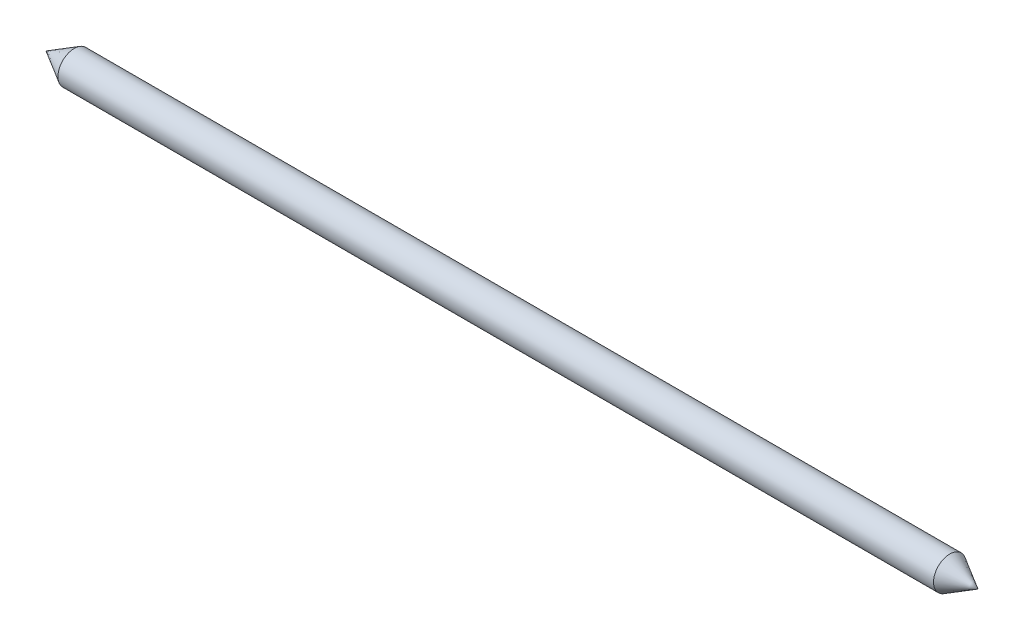
ISO-10303-21;
HEADER;
FILE_DESCRIPTION(('STEP AP214'),'2;1');
FILE_NAME('part.step','',(''),(''),'','','');
FILE_SCHEMA(('AUTOMOTIVE_DESIGN { 1 0 10303 214 1 1 1 1 }'));
ENDSEC;
DATA;
#1=APPLICATION_CONTEXT('core data for automotive mechanical design processes');
#2=APPLICATION_PROTOCOL_DEFINITION('international standard','automotive_design',2000,#1);
#3=PRODUCT_CONTEXT('',#1,'mechanical');
#4=PRODUCT('Part','Part','',(#3));
#5=PRODUCT_RELATED_PRODUCT_CATEGORY('part','',(#4));
#6=PRODUCT_DEFINITION_FORMATION('','',#4);
#7=PRODUCT_DEFINITION_CONTEXT('part definition',#1,'design');
#8=PRODUCT_DEFINITION('design','',#6,#7);
#9=PRODUCT_DEFINITION_SHAPE('','',#8);
#10=(LENGTH_UNIT() NAMED_UNIT(*) SI_UNIT(.MILLI.,.METRE.));
#11=(NAMED_UNIT(*) PLANE_ANGLE_UNIT() SI_UNIT($,.RADIAN.));
#12=(NAMED_UNIT(*) SI_UNIT($,.STERADIAN.) SOLID_ANGLE_UNIT());
#13=UNCERTAINTY_MEASURE_WITH_UNIT(LENGTH_MEASURE(1.E-05),#10,'distance_accuracy_value','');
#14=(GEOMETRIC_REPRESENTATION_CONTEXT(3) GLOBAL_UNCERTAINTY_ASSIGNED_CONTEXT((#13)) GLOBAL_UNIT_ASSIGNED_CONTEXT((#10,
#11,#12)) REPRESENTATION_CONTEXT('',''));
#15=CARTESIAN_POINT('',(0.,0.,0.));
#16=DIRECTION('',(0.,0.,1.));
#17=DIRECTION('',(1.,0.,0.));
#18=AXIS2_PLACEMENT_3D('',#15,#16,#17);
#19=CARTESIAN_POINT('',(0.,0.,0.));
#20=DIRECTION('',(1.,0.,0.));
#21=DIRECTION('',(0.,0.,1.));
#22=AXIS2_PLACEMENT_3D('',#19,#20,#21);
#23=CONICAL_SURFACE('',#22,0.,0.523598775598293);
#24=CARTESIAN_POINT('',(9.89867036525627,0.,0.));
#25=DIRECTION('',(1.,0.,0.));
#26=DIRECTION('',(0.,0.,-1.));
#27=AXIS2_PLACEMENT_3D('',#24,#25,#26);
#28=CIRCLE('',#27,5.715);
#29=CARTESIAN_POINT('',(9.89867036525627,0.,-5.715));
#30=VERTEX_POINT('',#29);
#31=EDGE_CURVE('E50',#30,#30,#28,.T.);
#32=ORIENTED_EDGE('',*,*,#31,.F.);
#33=EDGE_LOOP('',(#32));
#34=FACE_BOUND('',#33,.T.);
#35=CARTESIAN_POINT('',(0.,0.,0.));
#36=VERTEX_POINT('',#35);
#37=VERTEX_LOOP('',#36);
#38=FACE_BOUND('',#37,.T.);
#39=ADVANCED_FACE('F43',(#34,#38),#23,.T.);
#40=CARTESIAN_POINT('',(317.126329634744,0.,0.));
#41=DIRECTION('',(-1.,0.,0.));
#42=DIRECTION('',(0.,0.,-1.));
#43=AXIS2_PLACEMENT_3D('',#40,#41,#42);
#44=CONICAL_SURFACE('',#43,5.715,0.5235987755983);
#45=CARTESIAN_POINT('',(327.025,0.,0.));
#46=VERTEX_POINT('',#45);
#47=VERTEX_LOOP('',#46);
#48=FACE_BOUND('',#47,.T.);
#49=CARTESIAN_POINT('',(317.126329634744,0.,0.));
#50=DIRECTION('',(1.,0.,0.));
#51=DIRECTION('',(0.,0.,-1.));
#52=AXIS2_PLACEMENT_3D('',#49,#50,#51);
#53=CIRCLE('',#52,5.715);
#54=CARTESIAN_POINT('',(317.126329634744,0.,-5.715));
#55=VERTEX_POINT('',#54);
#56=EDGE_CURVE('E11',#55,#55,#53,.T.);
#57=ORIENTED_EDGE('',*,*,#56,.T.);
#58=EDGE_LOOP('',(#57));
#59=FACE_BOUND('',#58,.T.);
#60=ADVANCED_FACE('F56',(#48,#59),#44,.T.);
#61=CARTESIAN_POINT('',(0.,0.,0.));
#62=DIRECTION('',(-1.,0.,0.));
#63=DIRECTION('',(0.,0.,-1.));
#64=AXIS2_PLACEMENT_3D('',#61,#62,#63);
#65=CYLINDRICAL_SURFACE('',#64,5.715);
#66=ORIENTED_EDGE('',*,*,#56,.F.);
#67=EDGE_LOOP('',(#66));
#68=FACE_BOUND('',#67,.T.);
#69=ORIENTED_EDGE('',*,*,#31,.T.);
#70=EDGE_LOOP('',(#69));
#71=FACE_BOUND('',#70,.T.);
#72=ADVANCED_FACE('F59',(#68,#71),#65,.T.);
#73=CLOSED_SHELL('',(#39,#60,#72));
#74=MANIFOLD_SOLID_BREP('B2',#73);
#75=ADVANCED_BREP_SHAPE_REPRESENTATION('',(#18,#74),#14);
#76=SHAPE_DEFINITION_REPRESENTATION(#9,#75);
ENDSEC;
END-ISO-10303-21;
